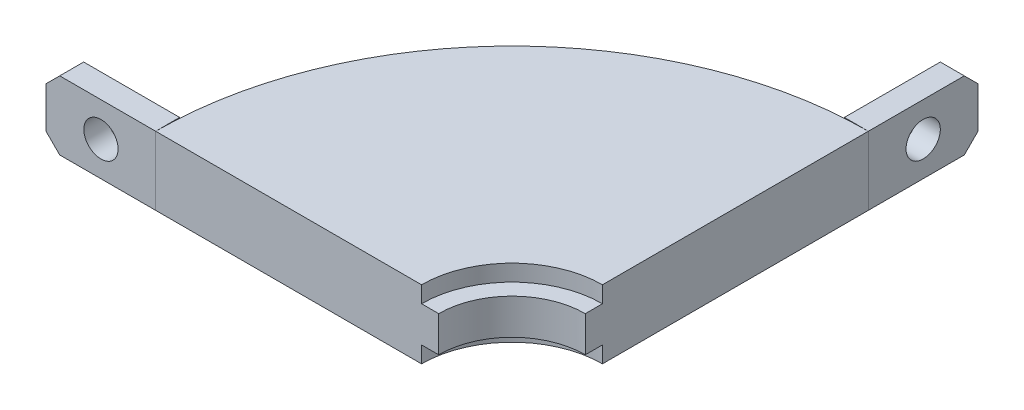
ISO-10303-21;
HEADER;
FILE_DESCRIPTION(('STEP AP214'),'2;1');
FILE_NAME('part.step','',(''),(''),'','','');
FILE_SCHEMA(('AUTOMOTIVE_DESIGN { 1 0 10303 214 1 1 1 1 }'));
ENDSEC;
DATA;
#1=APPLICATION_CONTEXT('core data for automotive mechanical design processes');
#2=APPLICATION_PROTOCOL_DEFINITION('international standard','automotive_design',2000,#1);
#3=PRODUCT_CONTEXT('',#1,'mechanical');
#4=PRODUCT('Part','Part','',(#3));
#5=PRODUCT_RELATED_PRODUCT_CATEGORY('part','',(#4));
#6=PRODUCT_DEFINITION_FORMATION('','',#4);
#7=PRODUCT_DEFINITION_CONTEXT('part definition',#1,'design');
#8=PRODUCT_DEFINITION('design','',#6,#7);
#9=PRODUCT_DEFINITION_SHAPE('','',#8);
#10=(LENGTH_UNIT() NAMED_UNIT(*) SI_UNIT(.MILLI.,.METRE.));
#11=(NAMED_UNIT(*) PLANE_ANGLE_UNIT() SI_UNIT($,.RADIAN.));
#12=(NAMED_UNIT(*) SI_UNIT($,.STERADIAN.) SOLID_ANGLE_UNIT());
#13=UNCERTAINTY_MEASURE_WITH_UNIT(LENGTH_MEASURE(1.E-05),#10,'distance_accuracy_value','');
#14=(GEOMETRIC_REPRESENTATION_CONTEXT(3) GLOBAL_UNCERTAINTY_ASSIGNED_CONTEXT((#13)) GLOBAL_UNIT_ASSIGNED_CONTEXT((#10,
#11,#12)) REPRESENTATION_CONTEXT('',''));
#15=CARTESIAN_POINT('',(0.,0.,0.));
#16=DIRECTION('',(0.,0.,1.));
#17=DIRECTION('',(1.,0.,0.));
#18=AXIS2_PLACEMENT_3D('',#15,#16,#17);
#19=CARTESIAN_POINT('',(-33.99,-1.2,0.));
#20=DIRECTION('',(0.,-1.,0.));
#21=DIRECTION('',(0.,0.,-1.));
#22=AXIS2_PLACEMENT_3D('',#19,#20,#21);
#23=PLANE('',#22);
#24=DIRECTION('',(1.,0.,0.));
#25=VECTOR('',#24,1.);
#26=CARTESIAN_POINT('',(-33.99,-1.2,0.));
#27=LINE('',#26,#25);
#28=CARTESIAN_POINT('',(-25.99875,-1.2,0.));
#29=VERTEX_POINT('',#28);
#30=CARTESIAN_POINT('',(-6.6,-1.2,0.));
#31=VERTEX_POINT('',#30);
#32=EDGE_CURVE('E116',#29,#31,#27,.T.);
#33=ORIENTED_EDGE('',*,*,#32,.F.);
#34=CARTESIAN_POINT('',(0.,-1.2,0.));
#35=DIRECTION('',(0.,1.,0.));
#36=DIRECTION('',(0.,0.,1.));
#37=AXIS2_PLACEMENT_3D('',#34,#35,#36);
#38=CIRCLE('',#37,26.);
#39=CARTESIAN_POINT('',(0.,-1.2,-25.9975));
#40=VERTEX_POINT('',#39);
#41=EDGE_CURVE('E123',#40,#29,#38,.T.);
#42=ORIENTED_EDGE('',*,*,#41,.F.);
#43=DIRECTION('',(0.,0.,-1.));
#44=VECTOR('',#43,1.);
#45=CARTESIAN_POINT('',(0.,-1.2,0.));
#46=LINE('',#45,#44);
#47=CARTESIAN_POINT('',(0.,-1.2,-6.6));
#48=VERTEX_POINT('',#47);
#49=EDGE_CURVE('E138',#48,#40,#46,.T.);
#50=ORIENTED_EDGE('',*,*,#49,.F.);
#51=CARTESIAN_POINT('',(0.,-1.2,0.));
#52=DIRECTION('',(0.,1.,0.));
#53=DIRECTION('',(0.,0.,1.));
#54=AXIS2_PLACEMENT_3D('',#51,#52,#53);
#55=CIRCLE('',#54,6.6);
#56=EDGE_CURVE('E136',#48,#31,#55,.T.);
#57=ORIENTED_EDGE('',*,*,#56,.T.);
#58=EDGE_LOOP('',(#33,#42,#50,#57));
#59=FACE_BOUND('',#58,.T.);
#60=ADVANCED_FACE('F53',(#59),#23,.T.);
#61=CARTESIAN_POINT('',(-33.99,3.8,0.));
#62=DIRECTION('',(0.,1.,0.));
#63=DIRECTION('',(0.,0.,1.));
#64=AXIS2_PLACEMENT_3D('',#61,#62,#63);
#65=PLANE('',#64);
#66=DIRECTION('',(-1.,0.,0.));
#67=VECTOR('',#66,1.);
#68=CARTESIAN_POINT('',(-33.99,3.8,0.));
#69=LINE('',#68,#67);
#70=CARTESIAN_POINT('',(-6.6,3.8,0.));
#71=VERTEX_POINT('',#70);
#72=CARTESIAN_POINT('',(-25.99875,3.8,0.));
#73=VERTEX_POINT('',#72);
#74=EDGE_CURVE('E12',#71,#73,#69,.T.);
#75=ORIENTED_EDGE('',*,*,#74,.F.);
#76=CARTESIAN_POINT('',(0.,3.8,0.));
#77=DIRECTION('',(0.,1.,0.));
#78=DIRECTION('',(0.,0.,1.));
#79=AXIS2_PLACEMENT_3D('',#76,#77,#78);
#80=CIRCLE('',#79,6.6);
#81=CARTESIAN_POINT('',(0.,3.8,-6.6));
#82=VERTEX_POINT('',#81);
#83=EDGE_CURVE('E157',#82,#71,#80,.T.);
#84=ORIENTED_EDGE('',*,*,#83,.F.);
#85=DIRECTION('',(0.,0.,1.));
#86=VECTOR('',#85,1.);
#87=CARTESIAN_POINT('',(0.,3.8,0.));
#88=LINE('',#87,#86);
#89=CARTESIAN_POINT('',(0.,3.8,-25.99875));
#90=VERTEX_POINT('',#89);
#91=EDGE_CURVE('E149',#90,#82,#88,.T.);
#92=ORIENTED_EDGE('',*,*,#91,.F.);
#93=CARTESIAN_POINT('',(0.,3.8,0.));
#94=DIRECTION('',(0.,1.,0.));
#95=DIRECTION('',(0.,0.,1.));
#96=AXIS2_PLACEMENT_3D('',#93,#94,#95);
#97=CIRCLE('',#96,26.);
#98=EDGE_CURVE('E132',#90,#73,#97,.T.);
#99=ORIENTED_EDGE('',*,*,#98,.T.);
#100=EDGE_LOOP('',(#75,#84,#92,#99));
#101=FACE_BOUND('',#100,.T.);
#102=ADVANCED_FACE('F220',(#101),#65,.T.);
#103=CARTESIAN_POINT('',(0.,-1.2,0.));
#104=DIRECTION('',(0.,1.,0.));
#105=DIRECTION('',(0.,0.,1.));
#106=AXIS2_PLACEMENT_3D('',#103,#104,#105);
#107=CYLINDRICAL_SURFACE('',#106,26.);
#108=ORIENTED_EDGE('',*,*,#41,.T.);
#109=CARTESIAN_POINT('',(-26.,-1.2,0.));
#110=DIRECTION('',(0.,1.,0.));
#111=VECTOR('',#110,1.);
#112=LINE('',#109,#111);
#113=EDGE_CURVE('E111',#29,#73,#112,.T.);
#114=ORIENTED_EDGE('',*,*,#113,.T.);
#115=ORIENTED_EDGE('',*,*,#98,.F.);
#116=CARTESIAN_POINT('',(0.,3.8,-26.));
#117=DIRECTION('',(0.,-1.,0.));
#118=VECTOR('',#117,1.);
#119=LINE('',#116,#118);
#120=EDGE_CURVE('E122',#90,#40,#119,.T.);
#121=ORIENTED_EDGE('',*,*,#120,.T.);
#122=EDGE_LOOP('',(#108,#114,#115,#121));
#123=FACE_BOUND('',#122,.T.);
#124=ADVANCED_FACE('F128',(#123),#107,.T.);
#125=CARTESIAN_POINT('',(0.,2.6,0.));
#126=DIRECTION('',(0.,1.,0.));
#127=DIRECTION('',(0.,0.,1.));
#128=AXIS2_PLACEMENT_3D('',#125,#126,#127);
#129=PLANE('',#128);
#130=DIRECTION('',(-1.,0.,0.));
#131=VECTOR('',#130,1.);
#132=CARTESIAN_POINT('',(0.,2.6,0.));
#133=LINE('',#132,#131);
#134=CARTESIAN_POINT('',(-5.35,2.6,0.));
#135=VERTEX_POINT('',#134);
#136=CARTESIAN_POINT('',(-6.6,2.6,0.));
#137=VERTEX_POINT('',#136);
#138=EDGE_CURVE('E64',#135,#137,#133,.T.);
#139=ORIENTED_EDGE('',*,*,#138,.F.);
#140=CARTESIAN_POINT('',(0.,2.6,0.));
#141=DIRECTION('',(0.,1.,0.));
#142=DIRECTION('',(0.,0.,1.));
#143=AXIS2_PLACEMENT_3D('',#140,#141,#142);
#144=CIRCLE('',#143,5.35);
#145=CARTESIAN_POINT('',(0.,2.6,-5.35));
#146=VERTEX_POINT('',#145);
#147=EDGE_CURVE('E167',#146,#135,#144,.T.);
#148=ORIENTED_EDGE('',*,*,#147,.F.);
#149=DIRECTION('',(0.,0.,1.));
#150=VECTOR('',#149,1.);
#151=CARTESIAN_POINT('',(0.,2.6,0.));
#152=LINE('',#151,#150);
#153=CARTESIAN_POINT('',(0.,2.6,-6.6));
#154=VERTEX_POINT('',#153);
#155=EDGE_CURVE('E202',#154,#146,#152,.T.);
#156=ORIENTED_EDGE('',*,*,#155,.F.);
#157=CARTESIAN_POINT('',(0.,2.6,0.));
#158=DIRECTION('',(0.,1.,0.));
#159=DIRECTION('',(0.,0.,1.));
#160=AXIS2_PLACEMENT_3D('',#157,#158,#159);
#161=CIRCLE('',#160,6.6);
#162=EDGE_CURVE('E169',#154,#137,#161,.T.);
#163=ORIENTED_EDGE('',*,*,#162,.T.);
#164=EDGE_LOOP('',(#139,#148,#156,#163));
#165=FACE_BOUND('',#164,.T.);
#166=ADVANCED_FACE('F236',(#165),#129,.T.);
#167=CARTESIAN_POINT('',(0.,0.,0.));
#168=DIRECTION('',(0.,1.,0.));
#169=DIRECTION('',(0.,0.,1.));
#170=AXIS2_PLACEMENT_3D('',#167,#168,#169);
#171=PLANE('',#170);
#172=CARTESIAN_POINT('',(0.,0.,0.));
#173=DIRECTION('',(0.,1.,0.));
#174=DIRECTION('',(0.,0.,1.));
#175=AXIS2_PLACEMENT_3D('',#172,#173,#174);
#176=CIRCLE('',#175,5.35);
#177=CARTESIAN_POINT('',(0.,0.,-5.35));
#178=VERTEX_POINT('',#177);
#179=CARTESIAN_POINT('',(-5.35,0.,0.));
#180=VERTEX_POINT('',#179);
#181=EDGE_CURVE('E161',#178,#180,#176,.T.);
#182=ORIENTED_EDGE('',*,*,#181,.T.);
#183=DIRECTION('',(-1.,0.,0.));
#184=VECTOR('',#183,1.);
#185=CARTESIAN_POINT('',(0.,0.,0.));
#186=LINE('',#185,#184);
#187=CARTESIAN_POINT('',(-6.6,0.,0.));
#188=VERTEX_POINT('',#187);
#189=EDGE_CURVE('E158',#180,#188,#186,.T.);
#190=ORIENTED_EDGE('',*,*,#189,.T.);
#191=CARTESIAN_POINT('',(0.,0.,0.));
#192=DIRECTION('',(0.,1.,0.));
#193=DIRECTION('',(0.,0.,1.));
#194=AXIS2_PLACEMENT_3D('',#191,#192,#193);
#195=CIRCLE('',#194,6.6);
#196=CARTESIAN_POINT('',(0.,0.,-6.6));
#197=VERTEX_POINT('',#196);
#198=EDGE_CURVE('E176',#197,#188,#195,.T.);
#199=ORIENTED_EDGE('',*,*,#198,.F.);
#200=DIRECTION('',(0.,0.,1.));
#201=VECTOR('',#200,1.);
#202=CARTESIAN_POINT('',(0.,0.,0.));
#203=LINE('',#202,#201);
#204=EDGE_CURVE('E160',#197,#178,#203,.T.);
#205=ORIENTED_EDGE('',*,*,#204,.T.);
#206=EDGE_LOOP('',(#182,#190,#199,#205));
#207=FACE_BOUND('',#206,.T.);
#208=ADVANCED_FACE('F242',(#207),#171,.F.);
#209=CARTESIAN_POINT('',(0.,2.6,0.));
#210=DIRECTION('',(0.,-1.,0.));
#211=DIRECTION('',(0.,0.,-1.));
#212=AXIS2_PLACEMENT_3D('',#209,#210,#211);
#213=CYLINDRICAL_SURFACE('',#212,5.35);
#214=DIRECTION('',(0.,-1.,0.));
#215=VECTOR('',#214,1.);
#216=CARTESIAN_POINT('',(-5.35,2.6,0.));
#217=LINE('',#216,#215);
#218=EDGE_CURVE('E137',#180,#135,#217,.F.);
#219=ORIENTED_EDGE('',*,*,#218,.F.);
#220=ORIENTED_EDGE('',*,*,#181,.F.);
#221=DIRECTION('',(0.,-1.,0.));
#222=VECTOR('',#221,1.);
#223=CARTESIAN_POINT('',(0.,2.6,-5.35));
#224=LINE('',#223,#222);
#225=EDGE_CURVE('E140',#146,#178,#224,.T.);
#226=ORIENTED_EDGE('',*,*,#225,.F.);
#227=ORIENTED_EDGE('',*,*,#147,.T.);
#228=EDGE_LOOP('',(#219,#220,#226,#227));
#229=FACE_BOUND('',#228,.T.);
#230=ADVANCED_FACE('F250',(#229),#213,.F.);
#231=CARTESIAN_POINT('',(0.,-1.2,0.));
#232=DIRECTION('',(0.,1.,0.));
#233=DIRECTION('',(0.,0.,1.));
#234=AXIS2_PLACEMENT_3D('',#231,#232,#233);
#235=CYLINDRICAL_SURFACE('',#234,6.6);
#236=ORIENTED_EDGE('',*,*,#198,.T.);
#237=DIRECTION('',(0.,1.,0.));
#238=VECTOR('',#237,1.);
#239=CARTESIAN_POINT('',(-6.6,-1.2,0.));
#240=LINE('',#239,#238);
#241=EDGE_CURVE('E144',#188,#31,#240,.F.);
#242=ORIENTED_EDGE('',*,*,#241,.T.);
#243=ORIENTED_EDGE('',*,*,#56,.F.);
#244=DIRECTION('',(0.,1.,0.));
#245=VECTOR('',#244,1.);
#246=CARTESIAN_POINT('',(0.,-1.2,-6.6));
#247=LINE('',#246,#245);
#248=EDGE_CURVE('E188',#48,#197,#247,.T.);
#249=ORIENTED_EDGE('',*,*,#248,.T.);
#250=EDGE_LOOP('',(#236,#242,#243,#249));
#251=FACE_BOUND('',#250,.T.);
#252=ADVANCED_FACE('F257',(#251),#235,.F.);
#253=ORIENTED_EDGE('',*,*,#83,.T.);
#254=DIRECTION('',(0.,1.,0.));
#255=VECTOR('',#254,1.);
#256=CARTESIAN_POINT('',(-6.6,-1.2,0.));
#257=LINE('',#256,#255);
#258=EDGE_CURVE('E153',#71,#137,#257,.F.);
#259=ORIENTED_EDGE('',*,*,#258,.T.);
#260=ORIENTED_EDGE('',*,*,#162,.F.);
#261=DIRECTION('',(0.,1.,0.));
#262=VECTOR('',#261,1.);
#263=CARTESIAN_POINT('',(0.,-1.2,-6.6));
#264=LINE('',#263,#262);
#265=EDGE_CURVE('E156',#154,#82,#264,.T.);
#266=ORIENTED_EDGE('',*,*,#265,.T.);
#267=EDGE_LOOP('',(#253,#259,#260,#266));
#268=FACE_BOUND('',#267,.T.);
#269=ADVANCED_FACE('F218',(#268),#235,.F.);
#270=CARTESIAN_POINT('',(0.,-6.2,0.));
#271=DIRECTION('',(-1.,0.,0.));
#272=DIRECTION('',(0.,0.,1.));
#273=AXIS2_PLACEMENT_3D('',#270,#271,#272);
#274=PLANE('',#273);
#275=ORIENTED_EDGE('',*,*,#120,.F.);
#276=ORIENTED_EDGE('',*,*,#91,.T.);
#277=ORIENTED_EDGE('',*,*,#265,.F.);
#278=ORIENTED_EDGE('',*,*,#155,.T.);
#279=ORIENTED_EDGE('',*,*,#225,.T.);
#280=ORIENTED_EDGE('',*,*,#204,.F.);
#281=ORIENTED_EDGE('',*,*,#248,.F.);
#282=ORIENTED_EDGE('',*,*,#49,.T.);
#283=EDGE_LOOP('',(#275,#276,#277,#278,#279,#280,#281,#282));
#284=FACE_BOUND('',#283,.T.);
#285=ADVANCED_FACE('F55',(#284),#274,.F.);
#286=CARTESIAN_POINT('',(-33.99,-6.2,0.));
#287=DIRECTION('',(0.,0.,-1.));
#288=DIRECTION('',(-1.,0.,0.));
#289=AXIS2_PLACEMENT_3D('',#286,#287,#288);
#290=PLANE('',#289);
#291=ORIENTED_EDGE('',*,*,#113,.F.);
#292=ORIENTED_EDGE('',*,*,#32,.T.);
#293=ORIENTED_EDGE('',*,*,#241,.F.);
#294=ORIENTED_EDGE('',*,*,#189,.F.);
#295=ORIENTED_EDGE('',*,*,#218,.T.);
#296=ORIENTED_EDGE('',*,*,#138,.T.);
#297=ORIENTED_EDGE('',*,*,#258,.F.);
#298=ORIENTED_EDGE('',*,*,#74,.T.);
#299=EDGE_LOOP('',(#291,#292,#293,#294,#295,#296,#297,#298));
#300=FACE_BOUND('',#299,.T.);
#301=ADVANCED_FACE('F114',(#300),#290,.F.);
#302=CLOSED_SHELL('',(#60,#102,#124,#166,#208,#230,#252,#269,#285,#301));
#303=MANIFOLD_SOLID_BREP('B2',#302);
#304=CARTESIAN_POINT('',(-33.99,3.8,-33.));
#305=DIRECTION('',(0.,-0.707106781186547,0.707106781186547));
#306=DIRECTION('',(-1.,0.,0.));
#307=AXIS2_PLACEMENT_3D('',#304,#305,#306);
#308=PLANE('',#307);
#309=DIRECTION('',(0.,-0.707106781186548,-0.707106781186548));
#310=VECTOR('',#309,1.);
#311=CARTESIAN_POINT('',(0.,3.3,-33.5));
#312=LINE('',#311,#310);
#313=CARTESIAN_POINT('',(0.,2.8,-34.));
#314=VERTEX_POINT('',#313);
#315=CARTESIAN_POINT('',(0.,3.8,-33.));
#316=VERTEX_POINT('',#315);
#317=EDGE_CURVE('E474',#314,#316,#312,.F.);
#318=ORIENTED_EDGE('',*,*,#317,.F.);
#319=DIRECTION('',(1.,0.,0.));
#320=VECTOR('',#319,1.);
#321=CARTESIAN_POINT('',(0.,2.8,-34.));
#322=LINE('',#321,#320);
#323=CARTESIAN_POINT('',(-1.75,2.8,-34.));
#324=VERTEX_POINT('',#323);
#325=EDGE_CURVE('E440',#324,#314,#322,.T.);
#326=ORIENTED_EDGE('',*,*,#325,.F.);
#327=DIRECTION('',(0.,0.707106781186548,0.707106781186548));
#328=VECTOR('',#327,1.);
#329=CARTESIAN_POINT('',(-1.75,3.3,-33.5));
#330=LINE('',#329,#328);
#331=CARTESIAN_POINT('',(-1.75,3.80000000000001,-33.));
#332=VERTEX_POINT('',#331);
#333=EDGE_CURVE('E436',#332,#324,#330,.F.);
#334=ORIENTED_EDGE('',*,*,#333,.F.);
#335=DIRECTION('',(-1.,0.,0.));
#336=VECTOR('',#335,1.);
#337=CARTESIAN_POINT('',(-33.99,3.8,-33.));
#338=LINE('',#337,#336);
#339=EDGE_CURVE('E439',#316,#332,#338,.T.);
#340=ORIENTED_EDGE('',*,*,#339,.F.);
#341=EDGE_LOOP('',(#318,#326,#334,#340));
#342=FACE_BOUND('',#341,.T.);
#343=ADVANCED_FACE('F382',(#342),#308,.F.);
#344=CARTESIAN_POINT('',(0.,0.,-34.));
#345=DIRECTION('',(0.,0.,-1.));
#346=DIRECTION('',(-1.,0.,0.));
#347=AXIS2_PLACEMENT_3D('',#344,#345,#346);
#348=PLANE('',#347);
#349=DIRECTION('',(0.,1.,0.));
#350=VECTOR('',#349,1.);
#351=CARTESIAN_POINT('',(0.,3.8,-34.));
#352=LINE('',#351,#350);
#353=CARTESIAN_POINT('',(0.,-0.20000000000001,-34.));
#354=VERTEX_POINT('',#353);
#355=EDGE_CURVE('E471',#354,#314,#352,.T.);
#356=ORIENTED_EDGE('',*,*,#355,.F.);
#357=DIRECTION('',(-1.,0.,0.));
#358=VECTOR('',#357,1.);
#359=CARTESIAN_POINT('',(0.,-0.20000000000001,-34.));
#360=LINE('',#359,#358);
#361=CARTESIAN_POINT('',(-1.75,-0.20000000000001,-34.));
#362=VERTEX_POINT('',#361);
#363=EDGE_CURVE('E517',#354,#362,#360,.T.);
#364=ORIENTED_EDGE('',*,*,#363,.T.);
#365=DIRECTION('',(0.,-1.,0.));
#366=VECTOR('',#365,1.);
#367=CARTESIAN_POINT('',(-1.75,3.80000000000001,-34.));
#368=LINE('',#367,#366);
#369=EDGE_CURVE('E469',#324,#362,#368,.T.);
#370=ORIENTED_EDGE('',*,*,#369,.F.);
#371=ORIENTED_EDGE('',*,*,#325,.T.);
#372=EDGE_LOOP('',(#356,#364,#370,#371));
#373=FACE_BOUND('',#372,.T.);
#374=ADVANCED_FACE('F497',(#373),#348,.T.);
#375=CARTESIAN_POINT('',(-33.99,-1.20000000000002,-33.));
#376=DIRECTION('',(0.,0.707106781186542,0.707106781186552));
#377=DIRECTION('',(1.,0.,0.));
#378=AXIS2_PLACEMENT_3D('',#375,#376,#377);
#379=PLANE('',#378);
#380=DIRECTION('',(0.,0.707106781186552,-0.707106781186543));
#381=VECTOR('',#380,1.);
#382=CARTESIAN_POINT('',(-1.75,1.80000000000003,-36.));
#383=LINE('',#382,#381);
#384=CARTESIAN_POINT('',(-1.75,-1.2,-33.));
#385=VERTEX_POINT('',#384);
#386=EDGE_CURVE('E465',#362,#385,#383,.F.);
#387=ORIENTED_EDGE('',*,*,#386,.F.);
#388=ORIENTED_EDGE('',*,*,#363,.F.);
#389=DIRECTION('',(0.,-0.707106781186552,0.707106781186543));
#390=VECTOR('',#389,1.);
#391=CARTESIAN_POINT('',(0.,1.80000000000002,-36.));
#392=LINE('',#391,#390);
#393=CARTESIAN_POINT('',(0.,-1.2,-33.));
#394=VERTEX_POINT('',#393);
#395=EDGE_CURVE('E475',#394,#354,#392,.F.);
#396=ORIENTED_EDGE('',*,*,#395,.F.);
#397=DIRECTION('',(1.,0.,0.));
#398=VECTOR('',#397,1.);
#399=CARTESIAN_POINT('',(-33.99,-1.20000000000002,-33.));
#400=LINE('',#399,#398);
#401=EDGE_CURVE('E457',#385,#394,#400,.T.);
#402=ORIENTED_EDGE('',*,*,#401,.F.);
#403=EDGE_LOOP('',(#387,#388,#396,#402));
#404=FACE_BOUND('',#403,.T.);
#405=ADVANCED_FACE('F491',(#404),#379,.F.);
#406=CARTESIAN_POINT('',(0.,0.,-26.));
#407=DIRECTION('',(0.,0.,-1.));
#408=DIRECTION('',(-1.,0.,0.));
#409=AXIS2_PLACEMENT_3D('',#406,#407,#408);
#410=PLANE('',#409);
#411=DIRECTION('',(0.,1.,0.));
#412=VECTOR('',#411,1.);
#413=CARTESIAN_POINT('',(0.,-6.2,-26.));
#414=LINE('',#413,#412);
#415=CARTESIAN_POINT('',(0.,3.8,-26.));
#416=VERTEX_POINT('',#415);
#417=CARTESIAN_POINT('',(0.,-1.20000000000001,-26.));
#418=VERTEX_POINT('',#417);
#419=EDGE_CURVE('E51',#416,#418,#414,.F.);
#420=ORIENTED_EDGE('',*,*,#419,.F.);
#421=DIRECTION('',(-1.,0.,0.));
#422=VECTOR('',#421,1.);
#423=CARTESIAN_POINT('',(0.,3.8,-26.));
#424=LINE('',#423,#422);
#425=CARTESIAN_POINT('',(-1.75,3.80000000000001,-26.));
#426=VERTEX_POINT('',#425);
#427=EDGE_CURVE('E468',#416,#426,#424,.T.);
#428=ORIENTED_EDGE('',*,*,#427,.T.);
#429=DIRECTION('',(0.,-1.,0.));
#430=VECTOR('',#429,1.);
#431=CARTESIAN_POINT('',(-1.75,3.80000000000001,-26.));
#432=LINE('',#431,#430);
#433=CARTESIAN_POINT('',(-1.75,-1.2,-26.));
#434=VERTEX_POINT('',#433);
#435=EDGE_CURVE('E455',#426,#434,#432,.T.);
#436=ORIENTED_EDGE('',*,*,#435,.T.);
#437=DIRECTION('',(1.,0.,0.));
#438=VECTOR('',#437,1.);
#439=CARTESIAN_POINT('',(0.,-1.2,-26.));
#440=LINE('',#439,#438);
#441=EDGE_CURVE('E467',#434,#418,#440,.T.);
#442=ORIENTED_EDGE('',*,*,#441,.T.);
#443=EDGE_LOOP('',(#420,#428,#436,#442));
#444=FACE_BOUND('',#443,.T.);
#445=ADVANCED_FACE('F485',(#444),#410,.F.);
#446=CARTESIAN_POINT('',(0.,3.8,-34.));
#447=DIRECTION('',(1.,0.,0.));
#448=DIRECTION('',(0.,0.,-1.));
#449=AXIS2_PLACEMENT_3D('',#446,#447,#448);
#450=PLANE('',#449);
#451=ORIENTED_EDGE('',*,*,#419,.T.);
#452=DIRECTION('',(0.,0.,1.));
#453=VECTOR('',#452,1.);
#454=CARTESIAN_POINT('',(0.,-1.2,-34.));
#455=LINE('',#454,#453);
#456=EDGE_CURVE('E397',#394,#418,#455,.T.);
#457=ORIENTED_EDGE('',*,*,#456,.F.);
#458=ORIENTED_EDGE('',*,*,#395,.T.);
#459=ORIENTED_EDGE('',*,*,#355,.T.);
#460=ORIENTED_EDGE('',*,*,#317,.T.);
#461=DIRECTION('',(0.,0.,1.));
#462=VECTOR('',#461,1.);
#463=CARTESIAN_POINT('',(0.,3.8,-34.));
#464=LINE('',#463,#462);
#465=EDGE_CURVE('E403',#316,#416,#464,.T.);
#466=ORIENTED_EDGE('',*,*,#465,.T.);
#467=EDGE_LOOP('',(#451,#457,#458,#459,#460,#466));
#468=FACE_BOUND('',#467,.T.);
#469=CARTESIAN_POINT('',(0.,1.3,-30.));
#470=DIRECTION('',(-1.,0.,0.));
#471=DIRECTION('',(0.,0.,1.));
#472=AXIS2_PLACEMENT_3D('',#469,#470,#471);
#473=CIRCLE('',#472,1.25);
#474=CARTESIAN_POINT('',(0.,1.3,-28.75));
#475=VERTEX_POINT('',#474);
#476=EDGE_CURVE('E445',#475,#475,#473,.F.);
#477=ORIENTED_EDGE('',*,*,#476,.F.);
#478=EDGE_LOOP('',(#477));
#479=FACE_BOUND('',#478,.T.);
#480=ADVANCED_FACE('F483',(#468,#479),#450,.T.);
#481=CARTESIAN_POINT('',(-33.99,3.8,0.));
#482=DIRECTION('',(0.,1.,0.));
#483=DIRECTION('',(0.,0.,1.));
#484=AXIS2_PLACEMENT_3D('',#481,#482,#483);
#485=PLANE('',#484);
#486=ORIENTED_EDGE('',*,*,#427,.F.);
#487=ORIENTED_EDGE('',*,*,#465,.F.);
#488=ORIENTED_EDGE('',*,*,#339,.T.);
#489=DIRECTION('',(0.,0.,1.));
#490=VECTOR('',#489,1.);
#491=CARTESIAN_POINT('',(-1.75,3.80000000000001,-34.));
#492=LINE('',#491,#490);
#493=EDGE_CURVE('E450',#332,#426,#492,.T.);
#494=ORIENTED_EDGE('',*,*,#493,.T.);
#495=EDGE_LOOP('',(#486,#487,#488,#494));
#496=FACE_BOUND('',#495,.T.);
#497=ADVANCED_FACE('F449',(#496),#485,.T.);
#498=CARTESIAN_POINT('',(-33.99,-1.2,0.));
#499=DIRECTION('',(0.,-1.,0.));
#500=DIRECTION('',(0.,0.,-1.));
#501=AXIS2_PLACEMENT_3D('',#498,#499,#500);
#502=PLANE('',#501);
#503=ORIENTED_EDGE('',*,*,#456,.T.);
#504=ORIENTED_EDGE('',*,*,#441,.F.);
#505=DIRECTION('',(0.,0.,1.));
#506=VECTOR('',#505,1.);
#507=CARTESIAN_POINT('',(-1.75,-1.2,-34.));
#508=LINE('',#507,#506);
#509=EDGE_CURVE('E446',#385,#434,#508,.T.);
#510=ORIENTED_EDGE('',*,*,#509,.F.);
#511=ORIENTED_EDGE('',*,*,#401,.T.);
#512=EDGE_LOOP('',(#503,#504,#510,#511));
#513=FACE_BOUND('',#512,.T.);
#514=ADVANCED_FACE('F384',(#513),#502,.T.);
#515=CARTESIAN_POINT('',(-1.75,3.80000000000001,-34.));
#516=DIRECTION('',(-1.,0.,0.));
#517=DIRECTION('',(0.,-1.,0.));
#518=AXIS2_PLACEMENT_3D('',#515,#516,#517);
#519=PLANE('',#518);
#520=CARTESIAN_POINT('',(-1.75,1.3,-30.));
#521=DIRECTION('',(-1.,0.,0.));
#522=DIRECTION('',(0.,-1.,0.));
#523=AXIS2_PLACEMENT_3D('',#520,#521,#522);
#524=CIRCLE('',#523,1.25);
#525=CARTESIAN_POINT('',(-1.75,0.0499999999999993,-30.));
#526=VERTEX_POINT('',#525);
#527=EDGE_CURVE('E390',#526,#526,#524,.T.);
#528=ORIENTED_EDGE('',*,*,#527,.F.);
#529=EDGE_LOOP('',(#528));
#530=FACE_BOUND('',#529,.T.);
#531=ORIENTED_EDGE('',*,*,#369,.T.);
#532=ORIENTED_EDGE('',*,*,#386,.T.);
#533=ORIENTED_EDGE('',*,*,#509,.T.);
#534=ORIENTED_EDGE('',*,*,#435,.F.);
#535=ORIENTED_EDGE('',*,*,#493,.F.);
#536=ORIENTED_EDGE('',*,*,#333,.T.);
#537=EDGE_LOOP('',(#531,#532,#533,#534,#535,#536));
#538=FACE_BOUND('',#537,.T.);
#539=ADVANCED_FACE('F453',(#530,#538),#519,.T.);
#540=CARTESIAN_POINT('',(6.25,1.3,-30.));
#541=DIRECTION('',(-1.,0.,0.));
#542=DIRECTION('',(0.,-1.,0.));
#543=AXIS2_PLACEMENT_3D('',#540,#541,#542);
#544=CYLINDRICAL_SURFACE('',#543,1.25);
#545=ORIENTED_EDGE('',*,*,#476,.T.);
#546=EDGE_LOOP('',(#545));
#547=FACE_BOUND('',#546,.T.);
#548=ORIENTED_EDGE('',*,*,#527,.T.);
#549=EDGE_LOOP('',(#548));
#550=FACE_BOUND('',#549,.T.);
#551=ADVANCED_FACE('F480',(#547,#550),#544,.F.);
#552=CLOSED_SHELL('',(#343,#374,#405,#445,#480,#497,#514,#539,#551));
#553=MANIFOLD_SOLID_BREP('B6',#552);
#554=CARTESIAN_POINT('',(-34.,0.,0.));
#555=DIRECTION('',(1.,0.,0.));
#556=DIRECTION('',(0.,0.,-1.));
#557=AXIS2_PLACEMENT_3D('',#554,#555,#556);
#558=PLANE('',#557);
#559=DIRECTION('',(0.,1.,0.));
#560=VECTOR('',#559,1.);
#561=CARTESIAN_POINT('',(-34.,3.8,-1.75));
#562=LINE('',#561,#560);
#563=CARTESIAN_POINT('',(-34.,-0.199999999999998,-1.75));
#564=VERTEX_POINT('',#563);
#565=CARTESIAN_POINT('',(-34.,2.8,-1.75));
#566=VERTEX_POINT('',#565);
#567=EDGE_CURVE('E700',#564,#566,#562,.T.);
#568=ORIENTED_EDGE('',*,*,#567,.F.);
#569=DIRECTION('',(0.,0.,1.));
#570=VECTOR('',#569,1.);
#571=CARTESIAN_POINT('',(-34.,-0.199999999999999,0.));
#572=LINE('',#571,#570);
#573=CARTESIAN_POINT('',(-34.,-0.199999999999999,0.));
#574=VERTEX_POINT('',#573);
#575=EDGE_CURVE('E658',#564,#574,#572,.T.);
#576=ORIENTED_EDGE('',*,*,#575,.T.);
#577=DIRECTION('',(0.,-1.,0.));
#578=VECTOR('',#577,1.);
#579=CARTESIAN_POINT('',(-34.,3.8,0.));
#580=LINE('',#579,#578);
#581=CARTESIAN_POINT('',(-34.,2.8,0.));
#582=VERTEX_POINT('',#581);
#583=EDGE_CURVE('E701',#582,#574,#580,.T.);
#584=ORIENTED_EDGE('',*,*,#583,.F.);
#585=DIRECTION('',(0.,0.,-1.));
#586=VECTOR('',#585,1.);
#587=CARTESIAN_POINT('',(-34.,2.8,-1.75));
#588=LINE('',#587,#586);
#589=EDGE_CURVE('E698',#582,#566,#588,.T.);
#590=ORIENTED_EDGE('',*,*,#589,.T.);
#591=EDGE_LOOP('',(#568,#576,#584,#590));
#592=FACE_BOUND('',#591,.T.);
#593=ADVANCED_FACE('F634',(#592),#558,.F.);
#594=CARTESIAN_POINT('',(-29.99,1.3,-6.25));
#595=DIRECTION('',(0.,0.,1.));
#596=DIRECTION('',(1.,0.,0.));
#597=AXIS2_PLACEMENT_3D('',#594,#595,#596);
#598=CYLINDRICAL_SURFACE('',#597,1.25);
#599=CARTESIAN_POINT('',(-29.99,1.3,0.));
#600=DIRECTION('',(0.,0.,-1.));
#601=DIRECTION('',(-1.,0.,0.));
#602=AXIS2_PLACEMENT_3D('',#599,#600,#601);
#603=CIRCLE('',#602,1.25);
#604=CARTESIAN_POINT('',(-31.24,1.3,0.));
#605=VERTEX_POINT('',#604);
#606=EDGE_CURVE('E748',#605,#605,#603,.F.);
#607=ORIENTED_EDGE('',*,*,#606,.T.);
#608=EDGE_LOOP('',(#607));
#609=FACE_BOUND('',#608,.T.);
#610=CARTESIAN_POINT('',(-29.99,1.3,-1.75));
#611=DIRECTION('',(0.,0.,-1.));
#612=DIRECTION('',(0.,1.,0.));
#613=AXIS2_PLACEMENT_3D('',#610,#611,#612);
#614=CIRCLE('',#613,1.25);
#615=CARTESIAN_POINT('',(-29.99,2.55,-1.75));
#616=VERTEX_POINT('',#615);
#617=EDGE_CURVE('E746',#616,#616,#614,.T.);
#618=ORIENTED_EDGE('',*,*,#617,.T.);
#619=EDGE_LOOP('',(#618));
#620=FACE_BOUND('',#619,.T.);
#621=ADVANCED_FACE('F770',(#609,#620),#598,.F.);
#622=CARTESIAN_POINT('',(-34.,3.8,-1.75));
#623=DIRECTION('',(0.,0.,-1.));
#624=DIRECTION('',(0.,1.,0.));
#625=AXIS2_PLACEMENT_3D('',#622,#623,#624);
#626=PLANE('',#625);
#627=ORIENTED_EDGE('',*,*,#617,.F.);
#628=EDGE_LOOP('',(#627));
#629=FACE_BOUND('',#628,.T.);
#630=DIRECTION('',(1.,0.,0.));
#631=VECTOR('',#630,1.);
#632=CARTESIAN_POINT('',(-34.,-1.2,-1.75));
#633=LINE('',#632,#631);
#634=CARTESIAN_POINT('',(-33.,-1.2,-1.75));
#635=VERTEX_POINT('',#634);
#636=CARTESIAN_POINT('',(-26.,-1.2,-1.75));
#637=VERTEX_POINT('',#636);
#638=EDGE_CURVE('E678',#635,#637,#633,.T.);
#639=ORIENTED_EDGE('',*,*,#638,.F.);
#640=DIRECTION('',(-0.707106781186548,0.707106781186548,0.));
#641=VECTOR('',#640,1.);
#642=CARTESIAN_POINT('',(-36.,1.8,-1.75));
#643=LINE('',#642,#641);
#644=EDGE_CURVE('E704',#635,#564,#643,.T.);
#645=ORIENTED_EDGE('',*,*,#644,.T.);
#646=ORIENTED_EDGE('',*,*,#567,.T.);
#647=DIRECTION('',(0.707106781186548,0.707106781186548,0.));
#648=VECTOR('',#647,1.);
#649=CARTESIAN_POINT('',(-33.5,3.3,-1.75));
#650=LINE('',#649,#648);
#651=CARTESIAN_POINT('',(-33.,3.8,-1.75));
#652=VERTEX_POINT('',#651);
#653=EDGE_CURVE('E708',#566,#652,#650,.T.);
#654=ORIENTED_EDGE('',*,*,#653,.T.);
#655=DIRECTION('',(1.,0.,0.));
#656=VECTOR('',#655,1.);
#657=CARTESIAN_POINT('',(-34.,3.8,-1.75));
#658=LINE('',#657,#656);
#659=CARTESIAN_POINT('',(-26.,3.8,-1.75));
#660=VERTEX_POINT('',#659);
#661=EDGE_CURVE('E733',#652,#660,#658,.T.);
#662=ORIENTED_EDGE('',*,*,#661,.T.);
#663=DIRECTION('',(0.,1.,0.));
#664=VECTOR('',#663,1.);
#665=CARTESIAN_POINT('',(-26.,3.8,-1.75));
#666=LINE('',#665,#664);
#667=EDGE_CURVE('E743',#637,#660,#666,.T.);
#668=ORIENTED_EDGE('',*,*,#667,.F.);
#669=EDGE_LOOP('',(#639,#645,#646,#654,#662,#668));
#670=FACE_BOUND('',#669,.T.);
#671=ADVANCED_FACE('F707',(#629,#670),#626,.T.);
#672=CARTESIAN_POINT('',(-33.,-1.2,0.));
#673=DIRECTION('',(-0.707106781186547,-0.707106781186547,0.));
#674=DIRECTION('',(0.,0.,1.));
#675=AXIS2_PLACEMENT_3D('',#672,#673,#674);
#676=PLANE('',#675);
#677=DIRECTION('',(0.707106781186548,-0.707106781186548,0.));
#678=VECTOR('',#677,1.);
#679=CARTESIAN_POINT('',(-36.,1.8,0.));
#680=LINE('',#679,#678);
#681=CARTESIAN_POINT('',(-33.,-1.2,0.));
#682=VERTEX_POINT('',#681);
#683=EDGE_CURVE('E643',#574,#682,#680,.T.);
#684=ORIENTED_EDGE('',*,*,#683,.F.);
#685=ORIENTED_EDGE('',*,*,#575,.F.);
#686=ORIENTED_EDGE('',*,*,#644,.F.);
#687=DIRECTION('',(0.,0.,-1.));
#688=VECTOR('',#687,1.);
#689=CARTESIAN_POINT('',(-33.,-1.2,-1.75));
#690=LINE('',#689,#688);
#691=EDGE_CURVE('E715',#682,#635,#690,.T.);
#692=ORIENTED_EDGE('',*,*,#691,.F.);
#693=EDGE_LOOP('',(#684,#685,#686,#692));
#694=FACE_BOUND('',#693,.T.);
#695=ADVANCED_FACE('F731',(#694),#676,.T.);
#696=CARTESIAN_POINT('',(-33.,3.8,0.));
#697=DIRECTION('',(-0.707106781186547,0.707106781186547,0.));
#698=DIRECTION('',(0.,0.,-1.));
#699=AXIS2_PLACEMENT_3D('',#696,#697,#698);
#700=PLANE('',#699);
#701=ORIENTED_EDGE('',*,*,#653,.F.);
#702=ORIENTED_EDGE('',*,*,#589,.F.);
#703=DIRECTION('',(-0.707106781186548,-0.707106781186548,0.));
#704=VECTOR('',#703,1.);
#705=CARTESIAN_POINT('',(-33.5,3.3,0.));
#706=LINE('',#705,#704);
#707=CARTESIAN_POINT('',(-33.,3.8,0.));
#708=VERTEX_POINT('',#707);
#709=EDGE_CURVE('E720',#708,#582,#706,.T.);
#710=ORIENTED_EDGE('',*,*,#709,.F.);
#711=DIRECTION('',(0.,0.,1.));
#712=VECTOR('',#711,1.);
#713=CARTESIAN_POINT('',(-33.,3.8,0.));
#714=LINE('',#713,#712);
#715=EDGE_CURVE('E712',#652,#708,#714,.T.);
#716=ORIENTED_EDGE('',*,*,#715,.F.);
#717=EDGE_LOOP('',(#701,#702,#710,#716));
#718=FACE_BOUND('',#717,.T.);
#719=ADVANCED_FACE('F637',(#718),#700,.T.);
#720=CARTESIAN_POINT('',(-34.,3.8,0.));
#721=DIRECTION('',(0.,0.,1.));
#722=DIRECTION('',(1.,0.,0.));
#723=AXIS2_PLACEMENT_3D('',#720,#721,#722);
#724=PLANE('',#723);
#725=ORIENTED_EDGE('',*,*,#709,.T.);
#726=ORIENTED_EDGE('',*,*,#583,.T.);
#727=ORIENTED_EDGE('',*,*,#683,.T.);
#728=DIRECTION('',(1.,0.,0.));
#729=VECTOR('',#728,1.);
#730=CARTESIAN_POINT('',(-34.,-1.2,0.));
#731=LINE('',#730,#729);
#732=CARTESIAN_POINT('',(-26.,-1.2,0.));
#733=VERTEX_POINT('',#732);
#734=EDGE_CURVE('E670',#682,#733,#731,.T.);
#735=ORIENTED_EDGE('',*,*,#734,.T.);
#736=DIRECTION('',(0.,1.,0.));
#737=VECTOR('',#736,1.);
#738=CARTESIAN_POINT('',(-26.,-6.2,0.));
#739=LINE('',#738,#737);
#740=CARTESIAN_POINT('',(-26.,3.8,0.));
#741=VERTEX_POINT('',#740);
#742=EDGE_CURVE('E380',#733,#741,#739,.T.);
#743=ORIENTED_EDGE('',*,*,#742,.T.);
#744=DIRECTION('',(1.,0.,0.));
#745=VECTOR('',#744,1.);
#746=CARTESIAN_POINT('',(-34.,3.8,0.));
#747=LINE('',#746,#745);
#748=EDGE_CURVE('E650',#708,#741,#747,.T.);
#749=ORIENTED_EDGE('',*,*,#748,.F.);
#750=EDGE_LOOP('',(#725,#726,#727,#735,#743,#749));
#751=FACE_BOUND('',#750,.T.);
#752=ORIENTED_EDGE('',*,*,#606,.F.);
#753=EDGE_LOOP('',(#752));
#754=FACE_BOUND('',#753,.T.);
#755=ADVANCED_FACE('F722',(#751,#754),#724,.T.);
#756=CARTESIAN_POINT('',(-26.,0.,0.));
#757=DIRECTION('',(1.,0.,0.));
#758=DIRECTION('',(0.,0.,-1.));
#759=AXIS2_PLACEMENT_3D('',#756,#757,#758);
#760=PLANE('',#759);
#761=ORIENTED_EDGE('',*,*,#742,.F.);
#762=DIRECTION('',(0.,0.,-1.));
#763=VECTOR('',#762,1.);
#764=CARTESIAN_POINT('',(-26.,-1.2,0.));
#765=LINE('',#764,#763);
#766=EDGE_CURVE('E728',#733,#637,#765,.T.);
#767=ORIENTED_EDGE('',*,*,#766,.T.);
#768=ORIENTED_EDGE('',*,*,#667,.T.);
#769=DIRECTION('',(0.,0.,1.));
#770=VECTOR('',#769,1.);
#771=CARTESIAN_POINT('',(-26.,3.8,0.));
#772=LINE('',#771,#770);
#773=EDGE_CURVE('E741',#660,#741,#772,.T.);
#774=ORIENTED_EDGE('',*,*,#773,.T.);
#775=EDGE_LOOP('',(#761,#767,#768,#774));
#776=FACE_BOUND('',#775,.T.);
#777=ADVANCED_FACE('F759',(#776),#760,.T.);
#778=CARTESIAN_POINT('',(-33.99,3.8,0.));
#779=DIRECTION('',(0.,1.,0.));
#780=DIRECTION('',(0.,0.,1.));
#781=AXIS2_PLACEMENT_3D('',#778,#779,#780);
#782=PLANE('',#781);
#783=ORIENTED_EDGE('',*,*,#748,.T.);
#784=ORIENTED_EDGE('',*,*,#773,.F.);
#785=ORIENTED_EDGE('',*,*,#661,.F.);
#786=ORIENTED_EDGE('',*,*,#715,.T.);
#787=EDGE_LOOP('',(#783,#784,#785,#786));
#788=FACE_BOUND('',#787,.T.);
#789=ADVANCED_FACE('F760',(#788),#782,.T.);
#790=CARTESIAN_POINT('',(-33.99,-1.2,0.));
#791=DIRECTION('',(0.,-1.,0.));
#792=DIRECTION('',(0.,0.,-1.));
#793=AXIS2_PLACEMENT_3D('',#790,#791,#792);
#794=PLANE('',#793);
#795=ORIENTED_EDGE('',*,*,#766,.F.);
#796=ORIENTED_EDGE('',*,*,#734,.F.);
#797=ORIENTED_EDGE('',*,*,#691,.T.);
#798=ORIENTED_EDGE('',*,*,#638,.T.);
#799=EDGE_LOOP('',(#795,#796,#797,#798));
#800=FACE_BOUND('',#799,.T.);
#801=ADVANCED_FACE('F726',(#800),#794,.T.);
#802=CLOSED_SHELL('',(#593,#621,#671,#695,#719,#755,#777,#789,#801));
#803=MANIFOLD_SOLID_BREP('B45',#802);
#804=ADVANCED_BREP_SHAPE_REPRESENTATION('',(#18,#303,#553,#803),#14);
#805=SHAPE_DEFINITION_REPRESENTATION(#9,#804);
ENDSEC;
END-ISO-10303-21;
